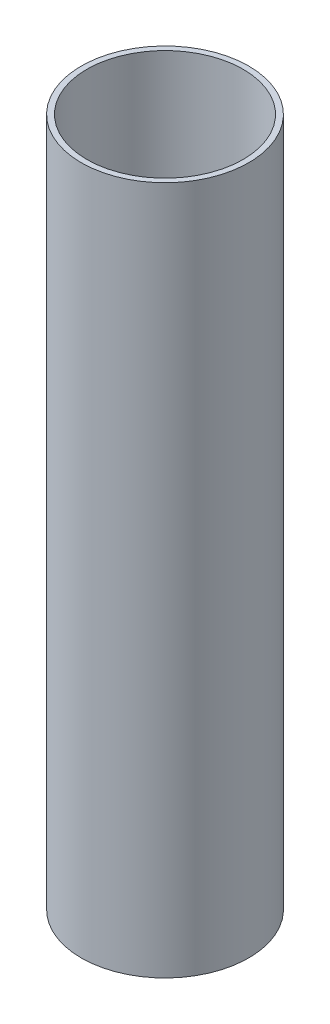
ISO-10303-21;
HEADER;
FILE_DESCRIPTION(('STEP AP214'),'2;1');
FILE_NAME('part.step','',(''),(''),'','','');
FILE_SCHEMA(('AUTOMOTIVE_DESIGN { 1 0 10303 214 1 1 1 1 }'));
ENDSEC;
DATA;
#1=APPLICATION_CONTEXT('core data for automotive mechanical design processes');
#2=APPLICATION_PROTOCOL_DEFINITION('international standard','automotive_design',2000,#1);
#3=PRODUCT_CONTEXT('',#1,'mechanical');
#4=PRODUCT('Part','Part','',(#3));
#5=PRODUCT_RELATED_PRODUCT_CATEGORY('part','',(#4));
#6=PRODUCT_DEFINITION_FORMATION('','',#4);
#7=PRODUCT_DEFINITION_CONTEXT('part definition',#1,'design');
#8=PRODUCT_DEFINITION('design','',#6,#7);
#9=PRODUCT_DEFINITION_SHAPE('','',#8);
#10=(LENGTH_UNIT() NAMED_UNIT(*) SI_UNIT(.MILLI.,.METRE.));
#11=(NAMED_UNIT(*) PLANE_ANGLE_UNIT() SI_UNIT($,.RADIAN.));
#12=(NAMED_UNIT(*) SI_UNIT($,.STERADIAN.) SOLID_ANGLE_UNIT());
#13=UNCERTAINTY_MEASURE_WITH_UNIT(LENGTH_MEASURE(1.E-05),#10,'distance_accuracy_value','');
#14=(GEOMETRIC_REPRESENTATION_CONTEXT(3) GLOBAL_UNCERTAINTY_ASSIGNED_CONTEXT((#13)) GLOBAL_UNIT_ASSIGNED_CONTEXT((#10,
#11,#12)) REPRESENTATION_CONTEXT('',''));
#15=CARTESIAN_POINT('',(0.,0.,0.));
#16=DIRECTION('',(0.,0.,1.));
#17=DIRECTION('',(1.,0.,0.));
#18=AXIS2_PLACEMENT_3D('',#15,#16,#17);
#19=CARTESIAN_POINT('',(0.,185.,0.));
#20=DIRECTION('',(0.,1.,0.));
#21=DIRECTION('',(0.,0.,1.));
#22=AXIS2_PLACEMENT_3D('',#19,#20,#21);
#23=PLANE('',#22);
#24=CARTESIAN_POINT('',(0.,185.,0.));
#25=DIRECTION('',(0.,1.,0.));
#26=DIRECTION('',(0.,0.,1.));
#27=AXIS2_PLACEMENT_3D('',#24,#25,#26);
#28=CIRCLE('',#27,22.5);
#29=CARTESIAN_POINT('',(0.,185.,22.5));
#30=VERTEX_POINT('',#29);
#31=EDGE_CURVE('E10',#30,#30,#28,.T.);
#32=ORIENTED_EDGE('',*,*,#31,.T.);
#33=EDGE_LOOP('',(#32));
#34=FACE_BOUND('',#33,.T.);
#35=CARTESIAN_POINT('',(0.,185.,0.));
#36=DIRECTION('',(0.,1.,0.));
#37=DIRECTION('',(0.,0.,1.));
#38=AXIS2_PLACEMENT_3D('',#35,#36,#37);
#39=CIRCLE('',#38,21.);
#40=CARTESIAN_POINT('',(0.,185.,21.));
#41=VERTEX_POINT('',#40);
#42=EDGE_CURVE('E50',#41,#41,#39,.T.);
#43=ORIENTED_EDGE('',*,*,#42,.F.);
#44=EDGE_LOOP('',(#43));
#45=FACE_BOUND('',#44,.T.);
#46=ADVANCED_FACE('F37',(#34,#45),#23,.T.);
#47=CARTESIAN_POINT('',(0.,0.,0.));
#48=DIRECTION('',(0.,1.,0.));
#49=DIRECTION('',(0.,0.,1.));
#50=AXIS2_PLACEMENT_3D('',#47,#48,#49);
#51=PLANE('',#50);
#52=CARTESIAN_POINT('',(0.,0.,0.));
#53=DIRECTION('',(0.,1.,0.));
#54=DIRECTION('',(0.,0.,1.));
#55=AXIS2_PLACEMENT_3D('',#52,#53,#54);
#56=CIRCLE('',#55,22.5);
#57=CARTESIAN_POINT('',(0.,0.,22.5));
#58=VERTEX_POINT('',#57);
#59=EDGE_CURVE('E41',#58,#58,#56,.T.);
#60=ORIENTED_EDGE('',*,*,#59,.F.);
#61=EDGE_LOOP('',(#60));
#62=FACE_BOUND('',#61,.T.);
#63=CARTESIAN_POINT('',(0.,0.,0.));
#64=DIRECTION('',(0.,1.,0.));
#65=DIRECTION('',(0.,0.,1.));
#66=AXIS2_PLACEMENT_3D('',#63,#64,#65);
#67=CIRCLE('',#66,21.);
#68=CARTESIAN_POINT('',(0.,0.,21.));
#69=VERTEX_POINT('',#68);
#70=EDGE_CURVE('E52',#69,#69,#67,.T.);
#71=ORIENTED_EDGE('',*,*,#70,.T.);
#72=EDGE_LOOP('',(#71));
#73=FACE_BOUND('',#72,.T.);
#74=ADVANCED_FACE('F64',(#62,#73),#51,.F.);
#75=CARTESIAN_POINT('',(0.,185.,0.));
#76=DIRECTION('',(0.,-1.,0.));
#77=DIRECTION('',(0.,0.,-1.));
#78=AXIS2_PLACEMENT_3D('',#75,#76,#77);
#79=CYLINDRICAL_SURFACE('',#78,22.5);
#80=ORIENTED_EDGE('',*,*,#31,.F.);
#81=EDGE_LOOP('',(#80));
#82=FACE_BOUND('',#81,.T.);
#83=ORIENTED_EDGE('',*,*,#59,.T.);
#84=EDGE_LOOP('',(#83));
#85=FACE_BOUND('',#84,.T.);
#86=ADVANCED_FACE('F39',(#82,#85),#79,.T.);
#87=CARTESIAN_POINT('',(0.,185.,0.));
#88=DIRECTION('',(0.,-1.,0.));
#89=DIRECTION('',(0.,0.,-1.));
#90=AXIS2_PLACEMENT_3D('',#87,#88,#89);
#91=CYLINDRICAL_SURFACE('',#90,21.);
#92=ORIENTED_EDGE('',*,*,#42,.T.);
#93=EDGE_LOOP('',(#92));
#94=FACE_BOUND('',#93,.T.);
#95=ORIENTED_EDGE('',*,*,#70,.F.);
#96=EDGE_LOOP('',(#95));
#97=FACE_BOUND('',#96,.T.);
#98=ADVANCED_FACE('F60',(#94,#97),#91,.F.);
#99=CLOSED_SHELL('',(#46,#74,#86,#98));
#100=MANIFOLD_SOLID_BREP('B2',#99);
#101=ADVANCED_BREP_SHAPE_REPRESENTATION('',(#18,#100),#14);
#102=SHAPE_DEFINITION_REPRESENTATION(#9,#101);
ENDSEC;
END-ISO-10303-21;
